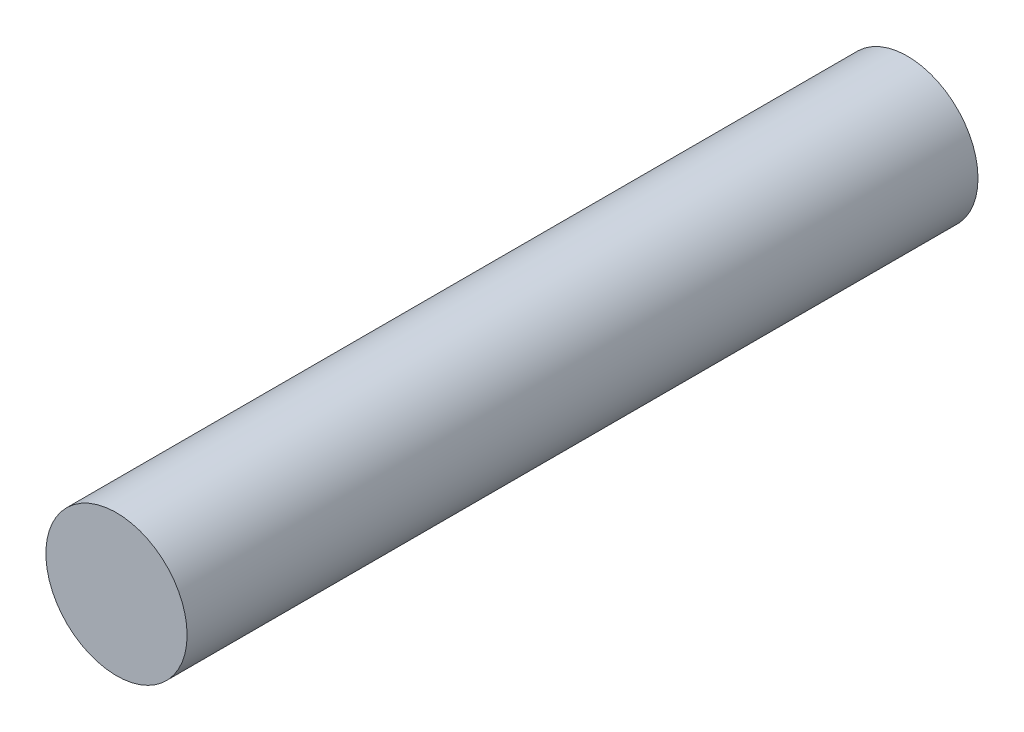
ISO-10303-21;
HEADER;
FILE_DESCRIPTION(('STEP AP214'),'2;1');
FILE_NAME('part.step','',(''),(''),'','','');
FILE_SCHEMA(('AUTOMOTIVE_DESIGN { 1 0 10303 214 1 1 1 1 }'));
ENDSEC;
DATA;
#1=APPLICATION_CONTEXT('core data for automotive mechanical design processes');
#2=APPLICATION_PROTOCOL_DEFINITION('international standard','automotive_design',2000,#1);
#3=PRODUCT_CONTEXT('',#1,'mechanical');
#4=PRODUCT('Part','Part','',(#3));
#5=PRODUCT_RELATED_PRODUCT_CATEGORY('part','',(#4));
#6=PRODUCT_DEFINITION_FORMATION('','',#4);
#7=PRODUCT_DEFINITION_CONTEXT('part definition',#1,'design');
#8=PRODUCT_DEFINITION('design','',#6,#7);
#9=PRODUCT_DEFINITION_SHAPE('','',#8);
#10=(LENGTH_UNIT() NAMED_UNIT(*) SI_UNIT(.MILLI.,.METRE.));
#11=(NAMED_UNIT(*) PLANE_ANGLE_UNIT() SI_UNIT($,.RADIAN.));
#12=(NAMED_UNIT(*) SI_UNIT($,.STERADIAN.) SOLID_ANGLE_UNIT());
#13=UNCERTAINTY_MEASURE_WITH_UNIT(LENGTH_MEASURE(1.E-05),#10,'distance_accuracy_value','');
#14=(GEOMETRIC_REPRESENTATION_CONTEXT(3) GLOBAL_UNCERTAINTY_ASSIGNED_CONTEXT((#13)) GLOBAL_UNIT_ASSIGNED_CONTEXT((#10,
#11,#12)) REPRESENTATION_CONTEXT('',''));
#15=CARTESIAN_POINT('',(0.,0.,0.));
#16=DIRECTION('',(0.,0.,1.));
#17=DIRECTION('',(1.,0.,0.));
#18=AXIS2_PLACEMENT_3D('',#15,#16,#17);
#19=CARTESIAN_POINT('',(0.,0.,28.));
#20=DIRECTION('',(0.,0.,-1.));
#21=DIRECTION('',(-1.,0.,0.));
#22=AXIS2_PLACEMENT_3D('',#19,#20,#21);
#23=CYLINDRICAL_SURFACE('',#22,2.5);
#24=CARTESIAN_POINT('',(0.,0.,28.));
#25=DIRECTION('',(0.,0.,1.));
#26=DIRECTION('',(1.,0.,0.));
#27=AXIS2_PLACEMENT_3D('',#24,#25,#26);
#28=CIRCLE('',#27,2.5);
#29=CARTESIAN_POINT('',(2.5,0.,28.));
#30=VERTEX_POINT('',#29);
#31=EDGE_CURVE('E10',#30,#30,#28,.T.);
#32=ORIENTED_EDGE('',*,*,#31,.F.);
#33=EDGE_LOOP('',(#32));
#34=FACE_BOUND('',#33,.T.);
#35=CARTESIAN_POINT('',(0.,0.,0.));
#36=DIRECTION('',(0.,0.,1.));
#37=DIRECTION('',(1.,0.,0.));
#38=AXIS2_PLACEMENT_3D('',#35,#36,#37);
#39=CIRCLE('',#38,2.5);
#40=CARTESIAN_POINT('',(2.5,0.,0.));
#41=VERTEX_POINT('',#40);
#42=EDGE_CURVE('E36',#41,#41,#39,.T.);
#43=ORIENTED_EDGE('',*,*,#42,.T.);
#44=EDGE_LOOP('',(#43));
#45=FACE_BOUND('',#44,.T.);
#46=ADVANCED_FACE('F33',(#34,#45),#23,.T.);
#47=CARTESIAN_POINT('',(0.,0.,28.));
#48=DIRECTION('',(0.,0.,1.));
#49=DIRECTION('',(1.,0.,0.));
#50=AXIS2_PLACEMENT_3D('',#47,#48,#49);
#51=PLANE('',#50);
#52=ORIENTED_EDGE('',*,*,#31,.T.);
#53=EDGE_LOOP('',(#52));
#54=FACE_BOUND('',#53,.T.);
#55=ADVANCED_FACE('F48',(#54),#51,.T.);
#56=CARTESIAN_POINT('',(0.,0.,0.));
#57=DIRECTION('',(0.,0.,1.));
#58=DIRECTION('',(1.,0.,0.));
#59=AXIS2_PLACEMENT_3D('',#56,#57,#58);
#60=PLANE('',#59);
#61=ORIENTED_EDGE('',*,*,#42,.F.);
#62=EDGE_LOOP('',(#61));
#63=FACE_BOUND('',#62,.T.);
#64=ADVANCED_FACE('F46',(#63),#60,.F.);
#65=CLOSED_SHELL('',(#46,#55,#64));
#66=MANIFOLD_SOLID_BREP('B2',#65);
#67=ADVANCED_BREP_SHAPE_REPRESENTATION('',(#18,#66),#14);
#68=SHAPE_DEFINITION_REPRESENTATION(#9,#67);
ENDSEC;
END-ISO-10303-21;
